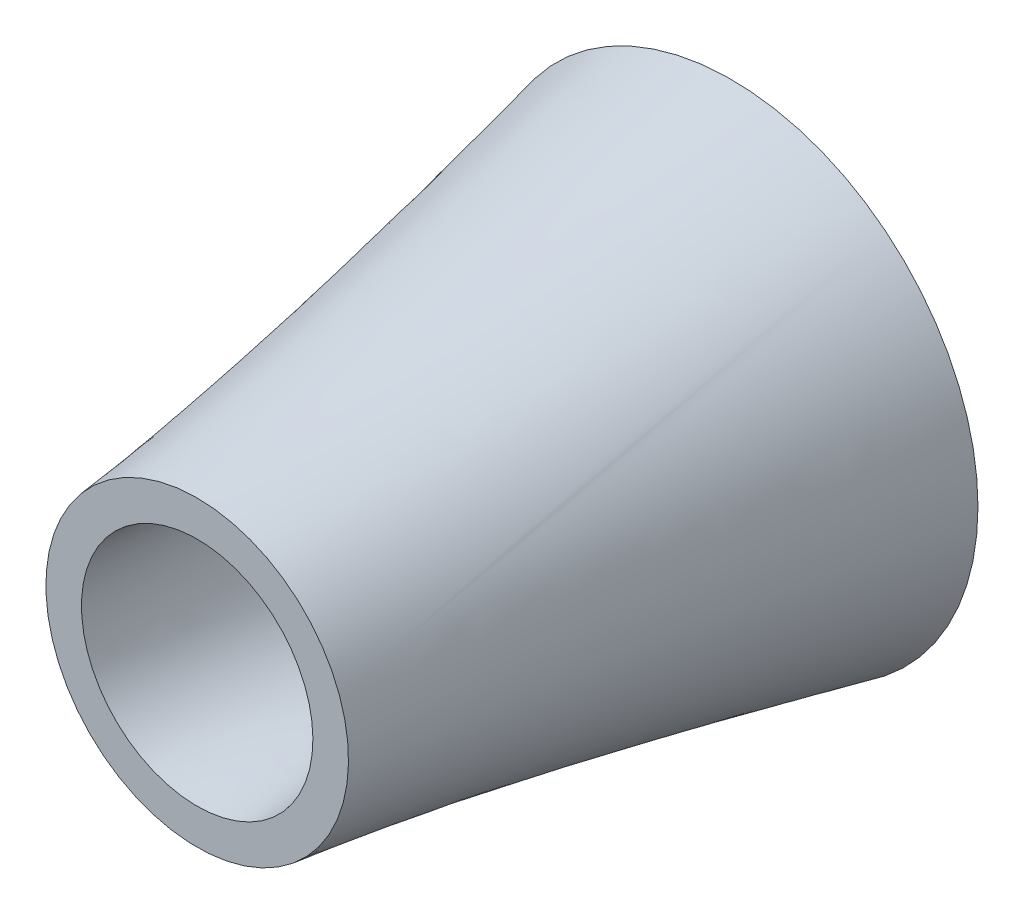
ISO-10303-21;
HEADER;
FILE_DESCRIPTION(('STEP AP214'),'2;1');
FILE_NAME('part.step','',(''),(''),'','','');
FILE_SCHEMA(('AUTOMOTIVE_DESIGN { 1 0 10303 214 1 1 1 1 }'));
ENDSEC;
DATA;
#1=APPLICATION_CONTEXT('core data for automotive mechanical design processes');
#2=APPLICATION_PROTOCOL_DEFINITION('international standard','automotive_design',2000,#1);
#3=PRODUCT_CONTEXT('',#1,'mechanical');
#4=PRODUCT('Part','Part','',(#3));
#5=PRODUCT_RELATED_PRODUCT_CATEGORY('part','',(#4));
#6=PRODUCT_DEFINITION_FORMATION('','',#4);
#7=PRODUCT_DEFINITION_CONTEXT('part definition',#1,'design');
#8=PRODUCT_DEFINITION('design','',#6,#7);
#9=PRODUCT_DEFINITION_SHAPE('','',#8);
#10=(LENGTH_UNIT() NAMED_UNIT(*) SI_UNIT(.MILLI.,.METRE.));
#11=(NAMED_UNIT(*) PLANE_ANGLE_UNIT() SI_UNIT($,.RADIAN.));
#12=(NAMED_UNIT(*) SI_UNIT($,.STERADIAN.) SOLID_ANGLE_UNIT());
#13=UNCERTAINTY_MEASURE_WITH_UNIT(LENGTH_MEASURE(1.E-05),#10,'distance_accuracy_value','');
#14=(GEOMETRIC_REPRESENTATION_CONTEXT(3) GLOBAL_UNCERTAINTY_ASSIGNED_CONTEXT((#13)) GLOBAL_UNIT_ASSIGNED_CONTEXT((#10,
#11,#12)) REPRESENTATION_CONTEXT('',''));
#15=CARTESIAN_POINT('',(0.,0.,0.));
#16=DIRECTION('',(0.,0.,1.));
#17=DIRECTION('',(1.,0.,0.));
#18=AXIS2_PLACEMENT_3D('',#15,#16,#17);
#19=CARTESIAN_POINT('',(177.565086814611,-57.2311730373818,61.));
#20=DIRECTION('',(0.,0.,1.));
#21=DIRECTION('',(1.,0.,0.));
#22=AXIS2_PLACEMENT_3D('',#19,#20,#21);
#23=PLANE('',#22);
#24=CARTESIAN_POINT('',(177.565086814611,-57.2311730373818,61.));
#25=DIRECTION('',(0.,0.,1.));
#26=DIRECTION('',(1.,0.,0.));
#27=AXIS2_PLACEMENT_3D('',#24,#25,#26);
#28=CIRCLE('',#27,3.25000000000001);
#29=CARTESIAN_POINT('',(180.786296753826,-56.7995406388017,61.));
#30=VERTEX_POINT('',#29);
#31=EDGE_CURVE('E49',#30,#30,#28,.T.);
#32=ORIENTED_EDGE('',*,*,#31,.F.);
#33=EDGE_LOOP('',(#32));
#34=FACE_BOUND('',#33,.T.);
#35=CARTESIAN_POINT('',(177.565086814611,-57.2311730373818,61.));
#36=DIRECTION('',(0.,0.,1.));
#37=DIRECTION('',(1.,0.,0.));
#38=AXIS2_PLACEMENT_3D('',#35,#36,#37);
#39=CIRCLE('',#38,4.25000000000001);
#40=CARTESIAN_POINT('',(181.556543196127,-55.7714552720413,61.));
#41=VERTEX_POINT('',#40);
#42=EDGE_CURVE('E10',#41,#41,#39,.T.);
#43=ORIENTED_EDGE('',*,*,#42,.T.);
#44=EDGE_LOOP('',(#43));
#45=FACE_BOUND('',#44,.T.);
#46=ADVANCED_FACE('F36',(#34,#45),#23,.T.);
#47=CARTESIAN_POINT('',(177.565086814611,-57.2311730373818,46.));
#48=DIRECTION('',(0.,0.,1.));
#49=DIRECTION('',(1.,0.,0.));
#50=AXIS2_PLACEMENT_3D('',#47,#48,#49);
#51=PLANE('',#50);
#52=CARTESIAN_POINT('',(177.565086814611,-57.2311730373818,46.));
#53=DIRECTION('',(0.,0.,1.));
#54=DIRECTION('',(1.,0.,0.));
#55=AXIS2_PLACEMENT_3D('',#52,#53,#54);
#56=CIRCLE('',#55,4.93);
#57=CARTESIAN_POINT('',(178.564828180719,-52.4036045810165,46.));
#58=VERTEX_POINT('',#57);
#59=EDGE_CURVE('E114',#58,#58,#56,.T.);
#60=ORIENTED_EDGE('',*,*,#59,.T.);
#61=EDGE_LOOP('',(#60));
#62=FACE_BOUND('',#61,.T.);
#63=CARTESIAN_POINT('',(177.565086814611,-57.2311730373818,46.));
#64=DIRECTION('',(0.,0.,1.));
#65=DIRECTION('',(1.,0.,0.));
#66=AXIS2_PLACEMENT_3D('',#63,#64,#65);
#67=CIRCLE('',#66,6.93);
#68=CARTESIAN_POINT('',(181.894619380869,-51.8200689210563,46.));
#69=VERTEX_POINT('',#68);
#70=EDGE_CURVE('E44',#69,#69,#67,.T.);
#71=ORIENTED_EDGE('',*,*,#70,.F.);
#72=EDGE_LOOP('',(#71));
#73=FACE_BOUND('',#72,.T.);
#74=ADVANCED_FACE('F68',(#62,#73),#51,.F.);
#75=CARTESIAN_POINT('',(181.894619380869,-51.8200689210563,46.));
#76=CARTESIAN_POINT('',(181.556543196127,-55.7714552720413,61.));
#77=CARTESIAN_POINT('',(171.072411148218,-43.161003788541,46.));
#78=CARTESIAN_POINT('',(178.637107665446,-47.7885425090081,61.));
#79=CARTESIAN_POINT('',(162.413346015702,-53.983212021192,46.));
#80=CARTESIAN_POINT('',(170.654194902413,-50.7079780396891,61.));
#81=CARTESIAN_POINT('',(173.235554248353,-62.6422771537073,46.));
#82=CARTESIAN_POINT('',(173.573630433094,-58.6908908027223,61.));
#83=CARTESIAN_POINT('',(184.057762481004,-71.3013422862225,46.));
#84=CARTESIAN_POINT('',(176.493065963775,-66.6738035657554,61.));
#85=CARTESIAN_POINT('',(192.716827613519,-60.4791340535716,46.));
#86=CARTESIAN_POINT('',(184.475978726808,-63.7543680350744,61.));
#87=CARTESIAN_POINT('',(181.894619380869,-51.8200689210563,46.));
#88=CARTESIAN_POINT('',(181.556543196127,-55.7714552720413,61.));
#89=(BOUNDED_SURFACE() B_SPLINE_SURFACE(3,1,((#75,#76),(#77,#78),(#79,#80),(#81,#82),(#83,#84),
(#85,#86),(#87,#88)),.UNSPECIFIED.,.T.,.F.,.F.) B_SPLINE_SURFACE_WITH_KNOTS((4,3,4),(2,2),(0.,
0.5,1.),(0.,1.),.UNSPECIFIED.) GEOMETRIC_REPRESENTATION_ITEM() RATIONAL_B_SPLINE_SURFACE(((1.,
1.),(0.333333333333333,0.333333333333333),(0.333333333333333,0.333333333333333),(1.,1.),
(0.333333333333333,0.333333333333334),(0.333333333333333,0.333333333333334),(1.,1.))) REPRESENTATION_ITEM('') SURFACE());
#90=CARTESIAN_POINT('',(181.894619380869,-51.8200689210563,46.));
#91=CARTESIAN_POINT('',(181.891097753944,-51.8612291955457,46.15625));
#92=CARTESIAN_POINT('',(181.88757612702,-51.9023894700352,46.3125));
#93=CARTESIAN_POINT('',(181.880532873171,-51.984710019014,46.625));
#94=CARTESIAN_POINT('',(181.877011246247,-52.0258702935035,46.78125));
#95=CARTESIAN_POINT('',(181.869967992398,-52.1081908424823,47.09375));
#96=CARTESIAN_POINT('',(181.866446365473,-52.1493511169717,47.25));
#97=CARTESIAN_POINT('',(181.859403111625,-52.2316716659506,47.5625));
#98=CARTESIAN_POINT('',(181.8558814847,-52.27283194044,47.71875));
#99=CARTESIAN_POINT('',(181.848838230852,-52.3551524894189,48.03125));
#100=CARTESIAN_POINT('',(181.845316603927,-52.3963127639083,48.1875));
#101=CARTESIAN_POINT('',(181.838273350078,-52.4786333128871,48.5));
#102=CARTESIAN_POINT('',(181.834751723154,-52.5197935873766,48.65625));
#103=CARTESIAN_POINT('',(181.827708469305,-52.6021141363554,48.96875));
#104=CARTESIAN_POINT('',(181.824186842381,-52.6432744108448,49.125));
#105=CARTESIAN_POINT('',(181.817143588532,-52.7255949598237,49.4375));
#106=CARTESIAN_POINT('',(181.813621961608,-52.7667552343131,49.59375));
#107=CARTESIAN_POINT('',(181.806578707759,-52.849075783292,49.90625));
#108=CARTESIAN_POINT('',(181.803057080834,-52.8902360577814,50.0625));
#109=CARTESIAN_POINT('',(181.796013826986,-52.9725566067603,50.375));
#110=CARTESIAN_POINT('',(181.792492200061,-53.0137168812497,50.53125));
#111=CARTESIAN_POINT('',(181.785448946213,-53.0960374302285,50.84375));
#112=CARTESIAN_POINT('',(181.781927319288,-53.137197704718,51.));
#113=CARTESIAN_POINT('',(181.774884065439,-53.2195182536968,51.3125));
#114=CARTESIAN_POINT('',(181.771362438515,-53.2606785281863,51.46875));
#115=CARTESIAN_POINT('',(181.764319184666,-53.3429990771651,51.78125));
#116=CARTESIAN_POINT('',(181.760797557742,-53.3841593516545,51.9375));
#117=CARTESIAN_POINT('',(181.753754303893,-53.4664799006334,52.25));
#118=CARTESIAN_POINT('',(181.750232676969,-53.5076401751228,52.40625));
#119=CARTESIAN_POINT('',(181.74318942312,-53.5899607241017,52.71875));
#120=CARTESIAN_POINT('',(181.739667796196,-53.6311209985911,52.875));
#121=CARTESIAN_POINT('',(181.732624542347,-53.7134415475699,53.1875));
#122=CARTESIAN_POINT('',(181.729102915422,-53.7546018220594,53.34375));
#123=CARTESIAN_POINT('',(181.722059661574,-53.8369223710382,53.65625));
#124=CARTESIAN_POINT('',(181.718538034649,-53.8780826455277,53.8125));
#125=CARTESIAN_POINT('',(181.7114947808,-53.9604031945065,54.125));
#126=CARTESIAN_POINT('',(181.707973153876,-54.0015634689959,54.28125));
#127=CARTESIAN_POINT('',(181.700929900027,-54.0838840179748,54.59375));
#128=CARTESIAN_POINT('',(181.697408273103,-54.1250442924642,54.75));
#129=CARTESIAN_POINT('',(181.690365019254,-54.2073648414431,55.0625));
#130=CARTESIAN_POINT('',(181.68684339233,-54.2485251159325,55.21875));
#131=CARTESIAN_POINT('',(181.679800138481,-54.3308456649114,55.53125));
#132=CARTESIAN_POINT('',(181.676278511557,-54.3720059394008,55.6875));
#133=CARTESIAN_POINT('',(181.669235257708,-54.4543264883796,56.));
#134=CARTESIAN_POINT('',(181.665713630783,-54.4954867628691,56.15625));
#135=CARTESIAN_POINT('',(181.658670376935,-54.5778073118479,56.46875));
#136=CARTESIAN_POINT('',(181.65514875001,-54.6189675863373,56.625));
#137=CARTESIAN_POINT('',(181.648105496161,-54.7012881353162,56.9375));
#138=CARTESIAN_POINT('',(181.644583869237,-54.7424484098056,57.09375));
#139=CARTESIAN_POINT('',(181.637540615388,-54.8247689587845,57.40625));
#140=CARTESIAN_POINT('',(181.634018988464,-54.8659292332739,57.5625));
#141=CARTESIAN_POINT('',(181.626975734615,-54.9482497822528,57.875));
#142=CARTESIAN_POINT('',(181.623454107691,-54.9894100567422,58.03125));
#143=CARTESIAN_POINT('',(181.616410853842,-55.071730605721,58.34375));
#144=CARTESIAN_POINT('',(181.612889226918,-55.1128908802105,58.5));
#145=CARTESIAN_POINT('',(181.605845973069,-55.1952114291893,58.8125));
#146=CARTESIAN_POINT('',(181.602324346144,-55.2363717036787,58.96875));
#147=CARTESIAN_POINT('',(181.595281092296,-55.3186922526576,59.28125));
#148=CARTESIAN_POINT('',(181.591759465371,-55.359852527147,59.4375));
#149=CARTESIAN_POINT('',(181.584716211523,-55.4421730761259,59.75));
#150=CARTESIAN_POINT('',(181.581194584598,-55.4833333506153,59.90625));
#151=CARTESIAN_POINT('',(181.574151330749,-55.5656538995942,60.21875));
#152=CARTESIAN_POINT('',(181.570629703825,-55.6068141740836,60.375));
#153=CARTESIAN_POINT('',(181.563586449976,-55.6891347230624,60.6875));
#154=CARTESIAN_POINT('',(181.560064823052,-55.7302949975519,60.84375));
#155=CARTESIAN_POINT('',(181.556543196127,-55.7714552720413,61.));
#156=B_SPLINE_CURVE_WITH_KNOTS('',3,(#90,#91,#92,#93,#94,#95,#96,#97,#98,#99,#100,#101,#102,
#103,#104,#105,#106,#107,#108,#109,#110,#111,#112,#113,#114,#115,#116,#117,#118,#119,#120,#121,
#122,#123,#124,#125,#126,#127,#128,#129,#130,#131,#132,#133,#134,#135,#136,#137,#138,#139,#140,
#141,#142,#143,#144,#145,#146,#147,#148,#149,#150,#151,#152,#153,#154,#155),.UNSPECIFIED.,.F.,
.F.,(4,2,2,2,2,2,2,2,2,2,2,2,2,2,2,2,2,2,2,2,2,2,2,2,2,2,2,2,2,2,2,2,4),(0.,0.484856363235702,
0.969712726471409,1.45456908970712,1.93942545294283,2.42428181617853,2.90913817941424,
3.39399454264995,3.87885090588566,4.36370726912136,4.84856363235706,5.33341999559278,
5.81827635882848,6.30313272206419,6.7879890852999,7.27284544853561,7.75770181177131,
8.24255817500701,8.72741453824272,9.21227090147844,9.69712726471414,10.1819836279498,
10.6668399911856,11.1516963544213,11.636552717657,12.1214090808927,12.6062654441284,
13.0911218073641,13.5759781705998,14.0608345338355,14.5456908970712,15.0305472603069,
15.5154036235426),.UNSPECIFIED.);
#157=EDGE_CURVE('BSEAM77',#69,#41,#156,.T.);
#158=ORIENTED_EDGE('',*,*,#70,.T.);
#159=ORIENTED_EDGE('',*,*,#42,.F.);
#160=ORIENTED_EDGE('',*,*,#157,.T.);
#161=ORIENTED_EDGE('',*,*,#157,.F.);
#162=EDGE_LOOP('',(#158,#160,#159,#161));
#163=FACE_BOUND('',#162,.T.);
#164=ADVANCED_FACE('F77',(#163),#89,.T.);
#165=CARTESIAN_POINT('',(178.564828180719,-52.4036045810165,46.));
#166=CARTESIAN_POINT('',(180.786296753826,-56.7995406388017,61.));
#167=CARTESIAN_POINT('',(168.909691267988,-50.4041218488012,46.));
#168=CARTESIAN_POINT('',(179.923031956665,-50.3571207603722,61.));
#169=CARTESIAN_POINT('',(166.910208535773,-60.0592587615319,46.));
#170=CARTESIAN_POINT('',(173.480612078236,-51.2203855575323,61.));
#171=CARTESIAN_POINT('',(176.565345448503,-62.0587414937471,46.));
#172=CARTESIAN_POINT('',(174.343876875396,-57.6628054359619,61.));
#173=CARTESIAN_POINT('',(186.220482361234,-64.0582242259623,46.));
#174=CARTESIAN_POINT('',(175.207141672556,-64.1052253143914,61.));
#175=CARTESIAN_POINT('',(188.219965093449,-54.4030873132317,46.));
#176=CARTESIAN_POINT('',(181.649561550986,-63.2419605172313,61.));
#177=CARTESIAN_POINT('',(178.564828180719,-52.4036045810165,46.));
#178=CARTESIAN_POINT('',(180.786296753826,-56.7995406388017,61.));
#179=(BOUNDED_SURFACE() B_SPLINE_SURFACE(3,1,((#165,#166),(#167,#168),(#169,#170),(#171,#172),
(#173,#174),(#175,#176),(#177,#178)),.UNSPECIFIED.,.T.,.F.,.F.) B_SPLINE_SURFACE_WITH_KNOTS((4,
3,4),(2,2),(0.,0.5,1.),(0.,1.),
.UNSPECIFIED.) GEOMETRIC_REPRESENTATION_ITEM() RATIONAL_B_SPLINE_SURFACE(((1.,1.),
(0.333333333333333,0.333333333333333),(0.333333333333333,0.333333333333333),(1.,1.),
(0.333333333333333,0.333333333333333),(0.333333333333333,0.333333333333333),(1.,1.))) REPRESENTATION_ITEM('') SURFACE());
#180=CARTESIAN_POINT('',(178.564828180719,-52.4036045810165,46.));
#181=CARTESIAN_POINT('',(178.587968478355,-52.4493955816184,46.15625));
#182=CARTESIAN_POINT('',(178.611108775992,-52.4951865822203,46.3125));
#183=CARTESIAN_POINT('',(178.657389371265,-52.5867685834242,46.625));
#184=CARTESIAN_POINT('',(178.680529668901,-52.6325595840261,46.78125));
#185=CARTESIAN_POINT('',(178.726810264174,-52.72414158523,47.09375));
#186=CARTESIAN_POINT('',(178.749950561811,-52.7699325858319,47.25));
#187=CARTESIAN_POINT('',(178.796231157084,-52.8615145870358,47.5625));
#188=CARTESIAN_POINT('',(178.81937145472,-52.9073055876377,47.71875));
#189=CARTESIAN_POINT('',(178.865652049993,-52.9988875888416,48.03125));
#190=CARTESIAN_POINT('',(178.88879234763,-53.0446785894435,48.1875));
#191=CARTESIAN_POINT('',(178.935072942903,-53.1362605906473,48.5));
#192=CARTESIAN_POINT('',(178.95821324054,-53.1820515912493,48.65625));
#193=CARTESIAN_POINT('',(179.004493835813,-53.2736335924531,48.96875));
#194=CARTESIAN_POINT('',(179.027634133449,-53.3194245930551,49.125));
#195=CARTESIAN_POINT('',(179.073914728722,-53.4110065942589,49.4375));
#196=CARTESIAN_POINT('',(179.097055026359,-53.4567975948609,49.59375));
#197=CARTESIAN_POINT('',(179.143335621632,-53.5483795960647,49.90625));
#198=CARTESIAN_POINT('',(179.166475919268,-53.5941705966666,50.0625));
#199=CARTESIAN_POINT('',(179.212756514541,-53.6857525978705,50.375));
#200=CARTESIAN_POINT('',(179.235896812178,-53.7315435984724,50.53125));
#201=CARTESIAN_POINT('',(179.282177407451,-53.8231255996763,50.84375));
#202=CARTESIAN_POINT('',(179.305317705088,-53.8689166002782,51.));
#203=CARTESIAN_POINT('',(179.351598300361,-53.9604986014821,51.3125));
#204=CARTESIAN_POINT('',(179.374738597997,-54.006289602084,51.46875));
#205=CARTESIAN_POINT('',(179.42101919327,-54.0978716032879,51.78125));
#206=CARTESIAN_POINT('',(179.444159490907,-54.1436626038898,51.9375));
#207=CARTESIAN_POINT('',(179.49044008618,-54.2352446050937,52.25));
#208=CARTESIAN_POINT('',(179.513580383816,-54.2810356056956,52.40625));
#209=CARTESIAN_POINT('',(179.559860979089,-54.3726176068994,52.71875));
#210=CARTESIAN_POINT('',(179.583001276726,-54.4184086075014,52.875));
#211=CARTESIAN_POINT('',(179.629281871999,-54.5099906087052,53.1875));
#212=CARTESIAN_POINT('',(179.652422169636,-54.5557816093072,53.34375));
#213=CARTESIAN_POINT('',(179.698702764909,-54.647363610511,53.65625));
#214=CARTESIAN_POINT('',(179.721843062545,-54.6931546111129,53.8125));
#215=CARTESIAN_POINT('',(179.768123657818,-54.7847366123168,54.125));
#216=CARTESIAN_POINT('',(179.791263955455,-54.8305276129187,54.28125));
#217=CARTESIAN_POINT('',(179.837544550728,-54.9221096141226,54.59375));
#218=CARTESIAN_POINT('',(179.860684848364,-54.9679006147245,54.75));
#219=CARTESIAN_POINT('',(179.906965443637,-55.0594826159284,55.0625));
#220=CARTESIAN_POINT('',(179.930105741274,-55.1052736165303,55.21875));
#221=CARTESIAN_POINT('',(179.976386336547,-55.1968556177342,55.53125));
#222=CARTESIAN_POINT('',(179.999526634184,-55.2426466183361,55.6875));
#223=CARTESIAN_POINT('',(180.045807229457,-55.33422861954,56.));
#224=CARTESIAN_POINT('',(180.068947527093,-55.3800196201419,56.15625));
#225=CARTESIAN_POINT('',(180.115228122366,-55.4716016213457,56.46875));
#226=CARTESIAN_POINT('',(180.138368420003,-55.5173926219477,56.625));
#227=CARTESIAN_POINT('',(180.184649015276,-55.6089746231515,56.9375));
#228=CARTESIAN_POINT('',(180.207789312912,-55.6547656237535,57.09375));
#229=CARTESIAN_POINT('',(180.254069908185,-55.7463476249573,57.40625));
#230=CARTESIAN_POINT('',(180.277210205822,-55.7921386255593,57.5625));
#231=CARTESIAN_POINT('',(180.323490801095,-55.8837206267631,57.875));
#232=CARTESIAN_POINT('',(180.346631098732,-55.929511627365,58.03125));
#233=CARTESIAN_POINT('',(180.392911694005,-56.0210936285689,58.34375));
#234=CARTESIAN_POINT('',(180.416051991641,-56.0668846291708,58.5));
#235=CARTESIAN_POINT('',(180.462332586914,-56.1584666303747,58.8125));
#236=CARTESIAN_POINT('',(180.485472884551,-56.2042576309766,58.96875));
#237=CARTESIAN_POINT('',(180.531753479824,-56.2958396321805,59.28125));
#238=CARTESIAN_POINT('',(180.55489377746,-56.3416306327824,59.4375));
#239=CARTESIAN_POINT('',(180.601174372733,-56.4332126339863,59.75));
#240=CARTESIAN_POINT('',(180.62431467037,-56.4790036345882,59.90625));
#241=CARTESIAN_POINT('',(180.670595265643,-56.5705856357921,60.21875));
#242=CARTESIAN_POINT('',(180.69373556328,-56.616376636394,60.375));
#243=CARTESIAN_POINT('',(180.740016158553,-56.7079586375978,60.6875));
#244=CARTESIAN_POINT('',(180.763156456189,-56.7537496381998,60.84375));
#245=CARTESIAN_POINT('',(180.786296753826,-56.7995406388017,61.));
#246=B_SPLINE_CURVE_WITH_KNOTS('',3,(#180,#181,#182,#183,#184,#185,#186,#187,#188,#189,#190,
#191,#192,#193,#194,#195,#196,#197,#198,#199,#200,#201,#202,#203,#204,#205,#206,#207,#208,#209,
#210,#211,#212,#213,#214,#215,#216,#217,#218,#219,#220,#221,#222,#223,#224,#225,#226,#227,#228,
#229,#230,#231,#232,#233,#234,#235,#236,#237,#238,#239,#240,#241,#242,#243,#244,#245),
.UNSPECIFIED.,.F.,.F.,(4,2,2,2,2,2,2,2,2,2,2,2,2,2,2,2,2,2,2,2,2,2,2,2,2,2,2,2,2,2,2,2,4),(0.,
0.493373250691092,0.986746501382189,1.48011975207329,1.97349300276439,2.46686625345547,
2.96023950414657,3.45361275483767,3.94698600552877,4.44035925621986,4.93373250691096,
5.42710575760205,5.92047900829315,6.41385225898424,6.90722550967534,7.40059876036644,
7.89397201105753,8.38734526174863,8.88071851243973,9.37409176313083,9.86746501382192,
10.360838264513,10.8542115152041,11.3475847658952,11.8409580165863,12.3343312672774,
12.8277045179685,13.3210777686596,13.8144510193507,14.3078242700418,14.8011975207329,
15.294570771424,15.7879440221151),.UNSPECIFIED.);
#247=EDGE_CURVE('BSEAM79',#58,#30,#246,.T.);
#248=ORIENTED_EDGE('',*,*,#59,.F.);
#249=ORIENTED_EDGE('',*,*,#31,.T.);
#250=ORIENTED_EDGE('',*,*,#247,.T.);
#251=ORIENTED_EDGE('',*,*,#247,.F.);
#252=EDGE_LOOP('',(#248,#250,#249,#251));
#253=FACE_BOUND('',#252,.T.);
#254=ADVANCED_FACE('F79',(#253),#179,.F.);
#255=CLOSED_SHELL('',(#46,#74,#164,#254));
#256=MANIFOLD_SOLID_BREP('B2',#255);
#257=ADVANCED_BREP_SHAPE_REPRESENTATION('',(#18,#256),#14);
#258=SHAPE_DEFINITION_REPRESENTATION(#9,#257);
ENDSEC;
END-ISO-10303-21;
